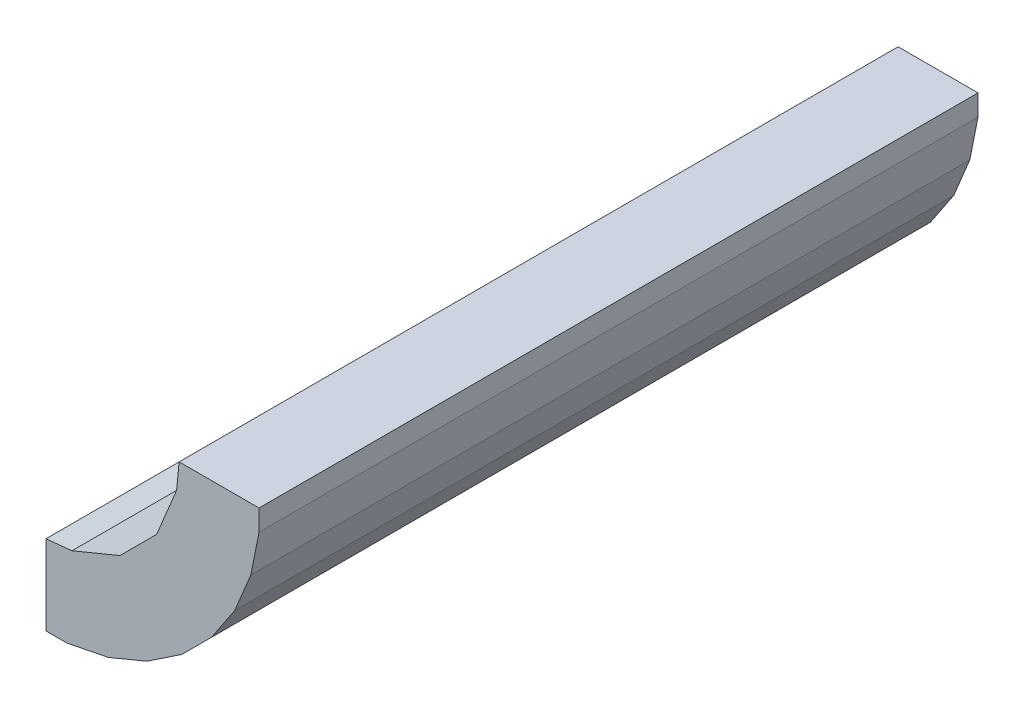
ISO-10303-21;
HEADER;
FILE_DESCRIPTION(('STEP AP214'),'2;1');
FILE_NAME('part.step','',(''),(''),'','','');
FILE_SCHEMA(('AUTOMOTIVE_DESIGN { 1 0 10303 214 1 1 1 1 }'));
ENDSEC;
DATA;
#1=APPLICATION_CONTEXT('core data for automotive mechanical design processes');
#2=APPLICATION_PROTOCOL_DEFINITION('international standard','automotive_design',2000,#1);
#3=PRODUCT_CONTEXT('',#1,'mechanical');
#4=PRODUCT('Part','Part','',(#3));
#5=PRODUCT_RELATED_PRODUCT_CATEGORY('part','',(#4));
#6=PRODUCT_DEFINITION_FORMATION('','',#4);
#7=PRODUCT_DEFINITION_CONTEXT('part definition',#1,'design');
#8=PRODUCT_DEFINITION('design','',#6,#7);
#9=PRODUCT_DEFINITION_SHAPE('','',#8);
#10=(LENGTH_UNIT() NAMED_UNIT(*) SI_UNIT(.MILLI.,.METRE.));
#11=(NAMED_UNIT(*) PLANE_ANGLE_UNIT() SI_UNIT($,.RADIAN.));
#12=(NAMED_UNIT(*) SI_UNIT($,.STERADIAN.) SOLID_ANGLE_UNIT());
#13=UNCERTAINTY_MEASURE_WITH_UNIT(LENGTH_MEASURE(1.E-05),#10,'distance_accuracy_value','');
#14=(GEOMETRIC_REPRESENTATION_CONTEXT(3) GLOBAL_UNCERTAINTY_ASSIGNED_CONTEXT((#13)) GLOBAL_UNIT_ASSIGNED_CONTEXT((#10,
#11,#12)) REPRESENTATION_CONTEXT('',''));
#15=CARTESIAN_POINT('',(0.,0.,0.));
#16=DIRECTION('',(0.,0.,1.));
#17=DIRECTION('',(1.,0.,0.));
#18=AXIS2_PLACEMENT_3D('',#15,#16,#17);
#19=CARTESIAN_POINT('',(11.894999117764,1.144999168945,0.));
#20=DIRECTION('',(0.995183620361721,-0.0980283722385425,0.));
#21=DIRECTION('',(0.,0.,-1.));
#22=AXIS2_PLACEMENT_3D('',#19,#20,#21);
#23=PLANE('',#22);
#24=DIRECTION('',(-0.0980283722385425,-0.995183620361721,0.));
#25=VECTOR('',#24,1.);
#26=CARTESIAN_POINT('',(11.894999117764,1.144999168945,0.));
#27=LINE('',#26,#25);
#28=CARTESIAN_POINT('',(11.894999117764,1.144999168945,0.));
#29=VERTEX_POINT('',#28);
#30=CARTESIAN_POINT('',(11.885390297764,1.047450468945,0.));
#31=VERTEX_POINT('',#30);
#32=EDGE_CURVE('E11',#29,#31,#27,.T.);
#33=ORIENTED_EDGE('',*,*,#32,.T.);
#34=DIRECTION('',(0.,0.,1.));
#35=VECTOR('',#34,1.);
#36=CARTESIAN_POINT('',(11.885390297764,1.047450468945,0.));
#37=LINE('',#36,#35);
#38=CARTESIAN_POINT('',(11.885390297764,1.047450468945,2.69999968));
#39=VERTEX_POINT('',#38);
#40=EDGE_CURVE('E24',#31,#39,#37,.T.);
#41=ORIENTED_EDGE('',*,*,#40,.T.);
#42=DIRECTION('',(-0.0980283722385425,-0.995183620361721,0.));
#43=VECTOR('',#42,1.);
#44=CARTESIAN_POINT('',(11.894999117764,1.144999168945,2.69999968));
#45=LINE('',#44,#43);
#46=CARTESIAN_POINT('',(11.894999117764,1.144999168945,2.69999968));
#47=VERTEX_POINT('',#46);
#48=EDGE_CURVE('E244',#47,#39,#45,.T.);
#49=ORIENTED_EDGE('',*,*,#48,.F.);
#50=DIRECTION('',(0.,0.,1.));
#51=VECTOR('',#50,1.);
#52=CARTESIAN_POINT('',(11.894999117764,1.144999168945,0.));
#53=LINE('',#52,#51);
#54=EDGE_CURVE('E150',#29,#47,#53,.T.);
#55=ORIENTED_EDGE('',*,*,#54,.F.);
#56=EDGE_LOOP('',(#33,#41,#49,#55));
#57=FACE_BOUND('',#56,.T.);
#58=ADVANCED_FACE('F17',(#57),#23,.F.);
#59=CARTESIAN_POINT('',(11.885390297764,1.047450468945,0.));
#60=DIRECTION('',(0.923879572096044,-0.382683336799019,0.));
#61=DIRECTION('',(0.,0.,-1.));
#62=AXIS2_PLACEMENT_3D('',#59,#60,#61);
#63=PLANE('',#62);
#64=DIRECTION('',(-0.382683336799019,-0.923879572096044,0.));
#65=VECTOR('',#64,1.);
#66=CARTESIAN_POINT('',(11.885390297764,1.047450468945,0.));
#67=LINE('',#66,#65);
#68=CARTESIAN_POINT('',(11.810732077764,0.867209528945,0.));
#69=VERTEX_POINT('',#68);
#70=EDGE_CURVE('E241',#31,#69,#67,.T.);
#71=ORIENTED_EDGE('',*,*,#70,.T.);
#72=DIRECTION('',(0.,0.,1.));
#73=VECTOR('',#72,1.);
#74=CARTESIAN_POINT('',(11.810732077764,0.867209528945,0.));
#75=LINE('',#74,#73);
#76=CARTESIAN_POINT('',(11.810732077764,0.867209528945,2.69999968));
#77=VERTEX_POINT('',#76);
#78=EDGE_CURVE('E239',#69,#77,#75,.T.);
#79=ORIENTED_EDGE('',*,*,#78,.T.);
#80=DIRECTION('',(-0.382683336799019,-0.923879572096044,0.));
#81=VECTOR('',#80,1.);
#82=CARTESIAN_POINT('',(11.885390297764,1.047450468945,2.69999968));
#83=LINE('',#82,#81);
#84=EDGE_CURVE('E236',#39,#77,#83,.T.);
#85=ORIENTED_EDGE('',*,*,#84,.F.);
#86=ORIENTED_EDGE('',*,*,#40,.F.);
#87=EDGE_LOOP('',(#71,#79,#85,#86));
#88=FACE_BOUND('',#87,.T.);
#89=ADVANCED_FACE('F248',(#88),#63,.F.);
#90=CARTESIAN_POINT('',(11.810732077764,0.867209528945,0.));
#91=DIRECTION('',(0.707106781186548,-0.707106781186548,0.));
#92=DIRECTION('',(0.,0.,-1.));
#93=AXIS2_PLACEMENT_3D('',#90,#91,#92);
#94=PLANE('',#93);
#95=DIRECTION('',(-0.707106781186548,-0.707106781186548,0.));
#96=VECTOR('',#95,1.);
#97=CARTESIAN_POINT('',(11.810732077764,0.867209528945,0.));
#98=LINE('',#97,#96);
#99=CARTESIAN_POINT('',(11.672784677764,0.729262128945,0.));
#100=VERTEX_POINT('',#99);
#101=EDGE_CURVE('E234',#69,#100,#98,.T.);
#102=ORIENTED_EDGE('',*,*,#101,.T.);
#103=DIRECTION('',(0.,0.,1.));
#104=VECTOR('',#103,1.);
#105=CARTESIAN_POINT('',(11.672784677764,0.729262128945,0.));
#106=LINE('',#105,#104);
#107=CARTESIAN_POINT('',(11.672784677764,0.729262128945,2.69999968));
#108=VERTEX_POINT('',#107);
#109=EDGE_CURVE('E232',#100,#108,#106,.T.);
#110=ORIENTED_EDGE('',*,*,#109,.T.);
#111=DIRECTION('',(-0.707106781186548,-0.707106781186548,0.));
#112=VECTOR('',#111,1.);
#113=CARTESIAN_POINT('',(11.810732077764,0.867209528945,2.69999968));
#114=LINE('',#113,#112);
#115=EDGE_CURVE('E229',#77,#108,#114,.T.);
#116=ORIENTED_EDGE('',*,*,#115,.F.);
#117=ORIENTED_EDGE('',*,*,#78,.F.);
#118=EDGE_LOOP('',(#102,#110,#116,#117));
#119=FACE_BOUND('',#118,.T.);
#120=ADVANCED_FACE('F252',(#119),#94,.F.);
#121=CARTESIAN_POINT('',(11.672784677764,0.729262128945,0.));
#122=DIRECTION('',(0.382683336799019,-0.923879572096044,0.));
#123=DIRECTION('',(0.,0.,-1.));
#124=AXIS2_PLACEMENT_3D('',#121,#122,#123);
#125=PLANE('',#124);
#126=DIRECTION('',(-0.923879572096044,-0.382683336799019,0.));
#127=VECTOR('',#126,1.);
#128=CARTESIAN_POINT('',(11.672784677764,0.729262128945,0.));
#129=LINE('',#128,#127);
#130=CARTESIAN_POINT('',(11.492543737764,0.654603908945,0.));
#131=VERTEX_POINT('',#130);
#132=EDGE_CURVE('E227',#100,#131,#129,.T.);
#133=ORIENTED_EDGE('',*,*,#132,.T.);
#134=DIRECTION('',(0.,0.,1.));
#135=VECTOR('',#134,1.);
#136=CARTESIAN_POINT('',(11.492543737764,0.654603908945,0.));
#137=LINE('',#136,#135);
#138=CARTESIAN_POINT('',(11.492543737764,0.654603908945,2.69999968));
#139=VERTEX_POINT('',#138);
#140=EDGE_CURVE('E225',#131,#139,#137,.T.);
#141=ORIENTED_EDGE('',*,*,#140,.T.);
#142=DIRECTION('',(-0.923879572096044,-0.382683336799019,0.));
#143=VECTOR('',#142,1.);
#144=CARTESIAN_POINT('',(11.672784677764,0.729262128945,2.69999968));
#145=LINE('',#144,#143);
#146=EDGE_CURVE('E222',#108,#139,#145,.T.);
#147=ORIENTED_EDGE('',*,*,#146,.F.);
#148=ORIENTED_EDGE('',*,*,#109,.F.);
#149=EDGE_LOOP('',(#133,#141,#147,#148));
#150=FACE_BOUND('',#149,.T.);
#151=ADVANCED_FACE('F260',(#150),#125,.F.);
#152=CARTESIAN_POINT('',(11.492543737764,0.654603908945,0.));
#153=DIRECTION('',(0.0980077631707123,-0.995185650197125,0.));
#154=DIRECTION('',(0.,0.,-1.));
#155=AXIS2_PLACEMENT_3D('',#152,#153,#154);
#156=PLANE('',#155);
#157=DIRECTION('',(-0.995185650197125,-0.0980077631707123,0.));
#158=VECTOR('',#157,1.);
#159=CARTESIAN_POINT('',(11.492543737764,0.654603908945,0.));
#160=LINE('',#159,#158);
#161=CARTESIAN_POINT('',(11.395000117764,0.644997628945,0.));
#162=VERTEX_POINT('',#161);
#163=EDGE_CURVE('E220',#131,#162,#160,.T.);
#164=ORIENTED_EDGE('',*,*,#163,.T.);
#165=DIRECTION('',(0.,0.,1.));
#166=VECTOR('',#165,1.);
#167=CARTESIAN_POINT('',(11.395000117764,0.644997628945,0.));
#168=LINE('',#167,#166);
#169=CARTESIAN_POINT('',(11.395000117764,0.644997628945,2.69999968));
#170=VERTEX_POINT('',#169);
#171=EDGE_CURVE('E218',#162,#170,#168,.T.);
#172=ORIENTED_EDGE('',*,*,#171,.T.);
#173=DIRECTION('',(-0.995185650197125,-0.0980077631707123,0.));
#174=VECTOR('',#173,1.);
#175=CARTESIAN_POINT('',(11.492543737764,0.654603908945,2.69999968));
#176=LINE('',#175,#174);
#177=EDGE_CURVE('E215',#139,#170,#176,.T.);
#178=ORIENTED_EDGE('',*,*,#177,.F.);
#179=ORIENTED_EDGE('',*,*,#140,.F.);
#180=EDGE_LOOP('',(#164,#172,#178,#179));
#181=FACE_BOUND('',#180,.T.);
#182=ADVANCED_FACE('F264',(#181),#156,.F.);
#183=CARTESIAN_POINT('',(11.395000117764,0.644997628945,0.));
#184=DIRECTION('',(1.,0.,0.));
#185=DIRECTION('',(0.,1.,0.));
#186=AXIS2_PLACEMENT_3D('',#183,#184,#185);
#187=PLANE('',#186);
#188=DIRECTION('',(0.,-1.,0.));
#189=VECTOR('',#188,1.);
#190=CARTESIAN_POINT('',(11.395000117764,0.644997628945,0.));
#191=LINE('',#190,#189);
#192=CARTESIAN_POINT('',(11.395000117764,0.344998228945,0.));
#193=VERTEX_POINT('',#192);
#194=EDGE_CURVE('E213',#162,#193,#191,.T.);
#195=ORIENTED_EDGE('',*,*,#194,.T.);
#196=DIRECTION('',(0.,0.,1.));
#197=VECTOR('',#196,1.);
#198=CARTESIAN_POINT('',(11.395000117764,0.344998228945,0.));
#199=LINE('',#198,#197);
#200=CARTESIAN_POINT('',(11.395000117764,0.344998228945,2.69999968));
#201=VERTEX_POINT('',#200);
#202=EDGE_CURVE('E211',#193,#201,#199,.T.);
#203=ORIENTED_EDGE('',*,*,#202,.T.);
#204=DIRECTION('',(0.,-1.,0.));
#205=VECTOR('',#204,1.);
#206=CARTESIAN_POINT('',(11.395000117764,0.644997628945,2.69999968));
#207=LINE('',#206,#205);
#208=EDGE_CURVE('E208',#170,#201,#207,.T.);
#209=ORIENTED_EDGE('',*,*,#208,.F.);
#210=ORIENTED_EDGE('',*,*,#171,.F.);
#211=EDGE_LOOP('',(#195,#203,#209,#210));
#212=FACE_BOUND('',#211,.T.);
#213=ADVANCED_FACE('F269',(#212),#187,.F.);
#214=CARTESIAN_POINT('',(11.395000117764,0.344998228945,0.));
#215=DIRECTION('',(0.,1.,0.));
#216=DIRECTION('',(1.,0.,0.));
#217=AXIS2_PLACEMENT_3D('',#214,#215,#216);
#218=PLANE('',#217);
#219=DIRECTION('',(1.,0.,0.));
#220=VECTOR('',#219,1.);
#221=CARTESIAN_POINT('',(11.395000117764,0.344998228945,0.));
#222=LINE('',#221,#220);
#223=CARTESIAN_POINT('',(11.473790917764,0.344998228945,0.));
#224=VERTEX_POINT('',#223);
#225=EDGE_CURVE('E206',#193,#224,#222,.T.);
#226=ORIENTED_EDGE('',*,*,#225,.T.);
#227=DIRECTION('',(0.,0.,1.));
#228=VECTOR('',#227,1.);
#229=CARTESIAN_POINT('',(11.473790917764,0.344998228945,0.));
#230=LINE('',#229,#228);
#231=CARTESIAN_POINT('',(11.473790917764,0.344998228945,2.69999968));
#232=VERTEX_POINT('',#231);
#233=EDGE_CURVE('E204',#224,#232,#230,.T.);
#234=ORIENTED_EDGE('',*,*,#233,.T.);
#235=DIRECTION('',(1.,0.,0.));
#236=VECTOR('',#235,1.);
#237=CARTESIAN_POINT('',(11.395000117764,0.344998228945,2.69999968));
#238=LINE('',#237,#236);
#239=EDGE_CURVE('E201',#201,#232,#238,.T.);
#240=ORIENTED_EDGE('',*,*,#239,.F.);
#241=ORIENTED_EDGE('',*,*,#202,.F.);
#242=EDGE_LOOP('',(#226,#234,#240,#241));
#243=FACE_BOUND('',#242,.T.);
#244=ADVANCED_FACE('F273',(#243),#218,.F.);
#245=CARTESIAN_POINT('',(11.473790917764,0.344998228945,0.));
#246=DIRECTION('',(-0.195077646083951,0.980787801717754,0.));
#247=DIRECTION('',(0.,0.,1.));
#248=AXIS2_PLACEMENT_3D('',#245,#246,#247);
#249=PLANE('',#248);
#250=DIRECTION('',(0.980787801717754,0.195077646083951,0.));
#251=VECTOR('',#250,1.);
#252=CARTESIAN_POINT('',(11.473790917764,0.344998228945,0.));
#253=LINE('',#252,#251);
#254=CARTESIAN_POINT('',(11.628349917764,0.375739848945,0.));
#255=VERTEX_POINT('',#254);
#256=EDGE_CURVE('E199',#224,#255,#253,.T.);
#257=ORIENTED_EDGE('',*,*,#256,.T.);
#258=DIRECTION('',(0.,0.,1.));
#259=VECTOR('',#258,1.);
#260=CARTESIAN_POINT('',(11.628349917764,0.375739848945,0.));
#261=LINE('',#260,#259);
#262=CARTESIAN_POINT('',(11.628349917764,0.375739848945,2.69999968));
#263=VERTEX_POINT('',#262);
#264=EDGE_CURVE('E197',#255,#263,#261,.T.);
#265=ORIENTED_EDGE('',*,*,#264,.T.);
#266=DIRECTION('',(0.980787801717754,0.195077646083951,0.));
#267=VECTOR('',#266,1.);
#268=CARTESIAN_POINT('',(11.473790917764,0.344998228945,2.69999968));
#269=LINE('',#268,#267);
#270=EDGE_CURVE('E194',#232,#263,#269,.T.);
#271=ORIENTED_EDGE('',*,*,#270,.F.);
#272=ORIENTED_EDGE('',*,*,#233,.F.);
#273=EDGE_LOOP('',(#257,#265,#271,#272));
#274=FACE_BOUND('',#273,.T.);
#275=ADVANCED_FACE('F280',(#274),#249,.F.);
#276=CARTESIAN_POINT('',(11.628349917764,0.375739848945,0.));
#277=DIRECTION('',(-0.382692963925958,0.9238755843519,0.));
#278=DIRECTION('',(0.,0.,1.));
#279=AXIS2_PLACEMENT_3D('',#276,#277,#278);
#280=PLANE('',#279);
#281=DIRECTION('',(0.9238755843519,0.382692963925958,0.));
#282=VECTOR('',#281,1.);
#283=CARTESIAN_POINT('',(11.628349917764,0.375739848945,0.));
#284=LINE('',#283,#282);
#285=CARTESIAN_POINT('',(11.773940177764,0.436047068945,0.));
#286=VERTEX_POINT('',#285);
#287=EDGE_CURVE('E192',#255,#286,#284,.T.);
#288=ORIENTED_EDGE('',*,*,#287,.T.);
#289=DIRECTION('',(0.,0.,1.));
#290=VECTOR('',#289,1.);
#291=CARTESIAN_POINT('',(11.773940177764,0.436047068945,0.));
#292=LINE('',#291,#290);
#293=CARTESIAN_POINT('',(11.773940177764,0.436047068945,2.69999968));
#294=VERTEX_POINT('',#293);
#295=EDGE_CURVE('E190',#286,#294,#292,.T.);
#296=ORIENTED_EDGE('',*,*,#295,.T.);
#297=DIRECTION('',(0.9238755843519,0.382692963925958,0.));
#298=VECTOR('',#297,1.);
#299=CARTESIAN_POINT('',(11.628349917764,0.375739848945,2.69999968));
#300=LINE('',#299,#298);
#301=EDGE_CURVE('E187',#263,#294,#300,.T.);
#302=ORIENTED_EDGE('',*,*,#301,.F.);
#303=ORIENTED_EDGE('',*,*,#264,.F.);
#304=EDGE_LOOP('',(#288,#296,#302,#303));
#305=FACE_BOUND('',#304,.T.);
#306=ADVANCED_FACE('F284',(#305),#280,.F.);
#307=CARTESIAN_POINT('',(11.773940177764,0.436047068945,0.));
#308=DIRECTION('',(-0.555562842653059,0.831474550340089,0.));
#309=DIRECTION('',(0.,0.,1.));
#310=AXIS2_PLACEMENT_3D('',#307,#308,#309);
#311=PLANE('',#310);
#312=DIRECTION('',(0.831474550340089,0.555562842653059,0.));
#313=VECTOR('',#312,1.);
#314=CARTESIAN_POINT('',(11.773940177764,0.436047068945,0.));
#315=LINE('',#314,#313);
#316=CARTESIAN_POINT('',(11.904968617764,0.523595788945,0.));
#317=VERTEX_POINT('',#316);
#318=EDGE_CURVE('E185',#286,#317,#315,.T.);
#319=ORIENTED_EDGE('',*,*,#318,.T.);
#320=DIRECTION('',(0.,0.,1.));
#321=VECTOR('',#320,1.);
#322=CARTESIAN_POINT('',(11.904968617764,0.523595788945,0.));
#323=LINE('',#322,#321);
#324=CARTESIAN_POINT('',(11.904968617764,0.523595788945,2.69999968));
#325=VERTEX_POINT('',#324);
#326=EDGE_CURVE('E183',#317,#325,#323,.T.);
#327=ORIENTED_EDGE('',*,*,#326,.T.);
#328=DIRECTION('',(0.831474550340089,0.555562842653059,0.));
#329=VECTOR('',#328,1.);
#330=CARTESIAN_POINT('',(11.773940177764,0.436047068945,2.69999968));
#331=LINE('',#330,#329);
#332=EDGE_CURVE('E180',#294,#325,#331,.T.);
#333=ORIENTED_EDGE('',*,*,#332,.F.);
#334=ORIENTED_EDGE('',*,*,#295,.F.);
#335=EDGE_LOOP('',(#319,#327,#333,#334));
#336=FACE_BOUND('',#335,.T.);
#337=ADVANCED_FACE('F289',(#336),#311,.F.);
#338=CARTESIAN_POINT('',(11.904968617764,0.523595788945,0.));
#339=DIRECTION('',(-0.707106781186548,0.707106781186548,0.));
#340=DIRECTION('',(0.,0.,1.));
#341=AXIS2_PLACEMENT_3D('',#338,#339,#340);
#342=PLANE('',#341);
#343=DIRECTION('',(0.707106781186548,0.707106781186548,0.));
#344=VECTOR('',#343,1.);
#345=CARTESIAN_POINT('',(11.904968617764,0.523595788945,0.));
#346=LINE('',#345,#344);
#347=CARTESIAN_POINT('',(12.016398417764,0.635025588945,0.));
#348=VERTEX_POINT('',#347);
#349=EDGE_CURVE('E178',#317,#348,#346,.T.);
#350=ORIENTED_EDGE('',*,*,#349,.T.);
#351=DIRECTION('',(0.,0.,1.));
#352=VECTOR('',#351,1.);
#353=CARTESIAN_POINT('',(12.016398417764,0.635025588945,0.));
#354=LINE('',#353,#352);
#355=CARTESIAN_POINT('',(12.016398417764,0.635025588945,2.69999968));
#356=VERTEX_POINT('',#355);
#357=EDGE_CURVE('E176',#348,#356,#354,.T.);
#358=ORIENTED_EDGE('',*,*,#357,.T.);
#359=DIRECTION('',(0.707106781186548,0.707106781186548,0.));
#360=VECTOR('',#359,1.);
#361=CARTESIAN_POINT('',(11.904968617764,0.523595788945,2.69999968));
#362=LINE('',#361,#360);
#363=EDGE_CURVE('E173',#325,#356,#362,.T.);
#364=ORIENTED_EDGE('',*,*,#363,.F.);
#365=ORIENTED_EDGE('',*,*,#326,.F.);
#366=EDGE_LOOP('',(#350,#358,#364,#365));
#367=FACE_BOUND('',#366,.T.);
#368=ADVANCED_FACE('F293',(#367),#342,.F.);
#369=CARTESIAN_POINT('',(12.016398417764,0.635025588945,0.));
#370=DIRECTION('',(-0.831474550340089,0.555562842653059,0.));
#371=DIRECTION('',(0.,0.,1.));
#372=AXIS2_PLACEMENT_3D('',#369,#370,#371);
#373=PLANE('',#372);
#374=DIRECTION('',(0.555562842653059,0.831474550340089,0.));
#375=VECTOR('',#374,1.);
#376=CARTESIAN_POINT('',(12.016398417764,0.635025588945,0.));
#377=LINE('',#376,#375);
#378=CARTESIAN_POINT('',(12.103947137764,0.766054028945,0.));
#379=VERTEX_POINT('',#378);
#380=EDGE_CURVE('E171',#348,#379,#377,.T.);
#381=ORIENTED_EDGE('',*,*,#380,.T.);
#382=DIRECTION('',(0.,0.,1.));
#383=VECTOR('',#382,1.);
#384=CARTESIAN_POINT('',(12.103947137764,0.766054028945,0.));
#385=LINE('',#384,#383);
#386=CARTESIAN_POINT('',(12.103947137764,0.766054028945,2.69999968));
#387=VERTEX_POINT('',#386);
#388=EDGE_CURVE('E169',#379,#387,#385,.T.);
#389=ORIENTED_EDGE('',*,*,#388,.T.);
#390=DIRECTION('',(0.555562842653059,0.831474550340089,0.));
#391=VECTOR('',#390,1.);
#392=CARTESIAN_POINT('',(12.016398417764,0.635025588945,2.69999968));
#393=LINE('',#392,#391);
#394=EDGE_CURVE('E166',#356,#387,#393,.T.);
#395=ORIENTED_EDGE('',*,*,#394,.F.);
#396=ORIENTED_EDGE('',*,*,#357,.F.);
#397=EDGE_LOOP('',(#381,#389,#395,#396));
#398=FACE_BOUND('',#397,.T.);
#399=ADVANCED_FACE('F300',(#398),#373,.F.);
#400=CARTESIAN_POINT('',(12.103947137764,0.766054028945,0.));
#401=DIRECTION('',(-0.9238755843519,0.382692963925958,0.));
#402=DIRECTION('',(0.,0.,1.));
#403=AXIS2_PLACEMENT_3D('',#400,#401,#402);
#404=PLANE('',#403);
#405=DIRECTION('',(0.382692963925958,0.9238755843519,0.));
#406=VECTOR('',#405,1.);
#407=CARTESIAN_POINT('',(12.103947137764,0.766054028945,0.));
#408=LINE('',#407,#406);
#409=CARTESIAN_POINT('',(12.164254357764,0.911644288945,0.));
#410=VERTEX_POINT('',#409);
#411=EDGE_CURVE('E164',#379,#410,#408,.T.);
#412=ORIENTED_EDGE('',*,*,#411,.T.);
#413=DIRECTION('',(0.,0.,1.));
#414=VECTOR('',#413,1.);
#415=CARTESIAN_POINT('',(12.164254357764,0.911644288945,0.));
#416=LINE('',#415,#414);
#417=CARTESIAN_POINT('',(12.164254357764,0.911644288945,2.69999968));
#418=VERTEX_POINT('',#417);
#419=EDGE_CURVE('E162',#410,#418,#416,.T.);
#420=ORIENTED_EDGE('',*,*,#419,.T.);
#421=DIRECTION('',(0.382692963925958,0.9238755843519,0.));
#422=VECTOR('',#421,1.);
#423=CARTESIAN_POINT('',(12.103947137764,0.766054028945,2.69999968));
#424=LINE('',#423,#422);
#425=EDGE_CURVE('E160',#387,#418,#424,.T.);
#426=ORIENTED_EDGE('',*,*,#425,.F.);
#427=ORIENTED_EDGE('',*,*,#388,.F.);
#428=EDGE_LOOP('',(#412,#420,#426,#427));
#429=FACE_BOUND('',#428,.T.);
#430=ADVANCED_FACE('F304',(#429),#404,.F.);
#431=CARTESIAN_POINT('',(12.164254357764,0.911644288945,0.));
#432=DIRECTION('',(-0.980784717728041,0.195093150754009,0.));
#433=DIRECTION('',(0.,0.,1.));
#434=AXIS2_PLACEMENT_3D('',#431,#432,#433);
#435=PLANE('',#434);
#436=DIRECTION('',(0.195093150754009,0.980784717728041,0.));
#437=VECTOR('',#436,1.);
#438=CARTESIAN_POINT('',(12.164254357764,0.911644288945,0.));
#439=LINE('',#438,#437);
#440=CARTESIAN_POINT('',(12.194998517764,1.066203288945,0.));
#441=VERTEX_POINT('',#440);
#442=EDGE_CURVE('E158',#410,#441,#439,.T.);
#443=ORIENTED_EDGE('',*,*,#442,.T.);
#444=DIRECTION('',(0.,0.,1.));
#445=VECTOR('',#444,1.);
#446=CARTESIAN_POINT('',(12.194998517764,1.066203288945,0.));
#447=LINE('',#446,#445);
#448=CARTESIAN_POINT('',(12.194998517764,1.066203288945,2.69999968));
#449=VERTEX_POINT('',#448);
#450=EDGE_CURVE('E156',#441,#449,#447,.T.);
#451=ORIENTED_EDGE('',*,*,#450,.T.);
#452=DIRECTION('',(0.195093150754009,0.980784717728041,0.));
#453=VECTOR('',#452,1.);
#454=CARTESIAN_POINT('',(12.164254357764,0.911644288945,2.69999968));
#455=LINE('',#454,#453);
#456=EDGE_CURVE('E145',#418,#449,#455,.T.);
#457=ORIENTED_EDGE('',*,*,#456,.F.);
#458=ORIENTED_EDGE('',*,*,#419,.F.);
#459=EDGE_LOOP('',(#443,#451,#457,#458));
#460=FACE_BOUND('',#459,.T.);
#461=ADVANCED_FACE('F307',(#460),#435,.F.);
#462=CARTESIAN_POINT('',(12.194998517764,1.066203288945,0.));
#463=DIRECTION('',(-1.,0.,0.));
#464=DIRECTION('',(0.,0.,1.));
#465=AXIS2_PLACEMENT_3D('',#462,#463,#464);
#466=PLANE('',#465);
#467=DIRECTION('',(0.,1.,0.));
#468=VECTOR('',#467,1.);
#469=CARTESIAN_POINT('',(12.194998517764,1.066203288945,0.));
#470=LINE('',#469,#468);
#471=CARTESIAN_POINT('',(12.194998517764,1.144996628945,0.));
#472=VERTEX_POINT('',#471);
#473=EDGE_CURVE('E132',#441,#472,#470,.T.);
#474=ORIENTED_EDGE('',*,*,#473,.T.);
#475=DIRECTION('',(0.,0.,1.));
#476=VECTOR('',#475,1.);
#477=CARTESIAN_POINT('',(12.194998517764,1.144996628945,0.));
#478=LINE('',#477,#476);
#479=CARTESIAN_POINT('',(12.194998517764,1.144996628945,2.69999968));
#480=VERTEX_POINT('',#479);
#481=EDGE_CURVE('E126',#472,#480,#478,.T.);
#482=ORIENTED_EDGE('',*,*,#481,.T.);
#483=DIRECTION('',(0.,1.,0.));
#484=VECTOR('',#483,1.);
#485=CARTESIAN_POINT('',(12.194998517764,1.066203288945,2.69999968));
#486=LINE('',#485,#484);
#487=EDGE_CURVE('E130',#449,#480,#486,.T.);
#488=ORIENTED_EDGE('',*,*,#487,.F.);
#489=ORIENTED_EDGE('',*,*,#450,.F.);
#490=EDGE_LOOP('',(#474,#482,#488,#489));
#491=FACE_BOUND('',#490,.T.);
#492=ADVANCED_FACE('F128',(#491),#466,.F.);
#493=CARTESIAN_POINT('',(12.194998517764,1.144996628945,0.));
#494=DIRECTION('',(-8.46668358972833E-06,-0.999999999964158,0.));
#495=DIRECTION('',(-0.999999999964158,8.46668358972833E-06,0.));
#496=AXIS2_PLACEMENT_3D('',#493,#494,#495);
#497=PLANE('',#496);
#498=DIRECTION('',(-0.999999999964158,8.46668358972833E-06,0.));
#499=VECTOR('',#498,1.);
#500=CARTESIAN_POINT('',(12.194998517764,1.144996628945,0.));
#501=LINE('',#500,#499);
#502=EDGE_CURVE('E146',#472,#29,#501,.T.);
#503=ORIENTED_EDGE('',*,*,#502,.T.);
#504=ORIENTED_EDGE('',*,*,#54,.T.);
#505=DIRECTION('',(-0.999999999964158,8.46668358972833E-06,0.));
#506=VECTOR('',#505,1.);
#507=CARTESIAN_POINT('',(12.194998517764,1.144996628945,2.69999968));
#508=LINE('',#507,#506);
#509=EDGE_CURVE('E142',#480,#47,#508,.T.);
#510=ORIENTED_EDGE('',*,*,#509,.F.);
#511=ORIENTED_EDGE('',*,*,#481,.F.);
#512=EDGE_LOOP('',(#503,#504,#510,#511));
#513=FACE_BOUND('',#512,.T.);
#514=ADVANCED_FACE('F149',(#513),#497,.F.);
#515=CARTESIAN_POINT('',(11.894999117764,1.144999168945,0.));
#516=DIRECTION('',(0.,0.,1.));
#517=DIRECTION('',(1.,0.,0.));
#518=AXIS2_PLACEMENT_3D('',#515,#516,#517);
#519=PLANE('',#518);
#520=ORIENTED_EDGE('',*,*,#502,.F.);
#521=ORIENTED_EDGE('',*,*,#473,.F.);
#522=ORIENTED_EDGE('',*,*,#442,.F.);
#523=ORIENTED_EDGE('',*,*,#411,.F.);
#524=ORIENTED_EDGE('',*,*,#380,.F.);
#525=ORIENTED_EDGE('',*,*,#349,.F.);
#526=ORIENTED_EDGE('',*,*,#318,.F.);
#527=ORIENTED_EDGE('',*,*,#287,.F.);
#528=ORIENTED_EDGE('',*,*,#256,.F.);
#529=ORIENTED_EDGE('',*,*,#225,.F.);
#530=ORIENTED_EDGE('',*,*,#194,.F.);
#531=ORIENTED_EDGE('',*,*,#163,.F.);
#532=ORIENTED_EDGE('',*,*,#132,.F.);
#533=ORIENTED_EDGE('',*,*,#101,.F.);
#534=ORIENTED_EDGE('',*,*,#70,.F.);
#535=ORIENTED_EDGE('',*,*,#32,.F.);
#536=EDGE_LOOP('',(#520,#521,#522,#523,#524,#525,#526,#527,#528,#529,#530,#531,#532,#533,#534,#535));
#537=FACE_BOUND('',#536,.T.);
#538=ADVANCED_FACE('F255',(#537),#519,.F.);
#539=CARTESIAN_POINT('',(11.894999117764,1.144999168945,2.69999968));
#540=DIRECTION('',(0.,0.,1.));
#541=DIRECTION('',(1.,0.,0.));
#542=AXIS2_PLACEMENT_3D('',#539,#540,#541);
#543=PLANE('',#542);
#544=ORIENTED_EDGE('',*,*,#48,.T.);
#545=ORIENTED_EDGE('',*,*,#84,.T.);
#546=ORIENTED_EDGE('',*,*,#115,.T.);
#547=ORIENTED_EDGE('',*,*,#146,.T.);
#548=ORIENTED_EDGE('',*,*,#177,.T.);
#549=ORIENTED_EDGE('',*,*,#208,.T.);
#550=ORIENTED_EDGE('',*,*,#239,.T.);
#551=ORIENTED_EDGE('',*,*,#270,.T.);
#552=ORIENTED_EDGE('',*,*,#301,.T.);
#553=ORIENTED_EDGE('',*,*,#332,.T.);
#554=ORIENTED_EDGE('',*,*,#363,.T.);
#555=ORIENTED_EDGE('',*,*,#394,.T.);
#556=ORIENTED_EDGE('',*,*,#425,.T.);
#557=ORIENTED_EDGE('',*,*,#456,.T.);
#558=ORIENTED_EDGE('',*,*,#487,.T.);
#559=ORIENTED_EDGE('',*,*,#509,.T.);
#560=EDGE_LOOP('',(#544,#545,#546,#547,#548,#549,#550,#551,#552,#553,#554,#555,#556,#557,#558,#559));
#561=FACE_BOUND('',#560,.T.);
#562=ADVANCED_FACE('F141',(#561),#543,.T.);
#563=CLOSED_SHELL('',(#58,#89,#120,#151,#182,#213,#244,#275,#306,#337,#368,#399,#430,#461,#492,
#514,#538,#562));
#564=MANIFOLD_SOLID_BREP('B1',#563);
#565=ADVANCED_BREP_SHAPE_REPRESENTATION('',(#18,#564),#14);
#566=SHAPE_DEFINITION_REPRESENTATION(#9,#565);
ENDSEC;
END-ISO-10303-21;
